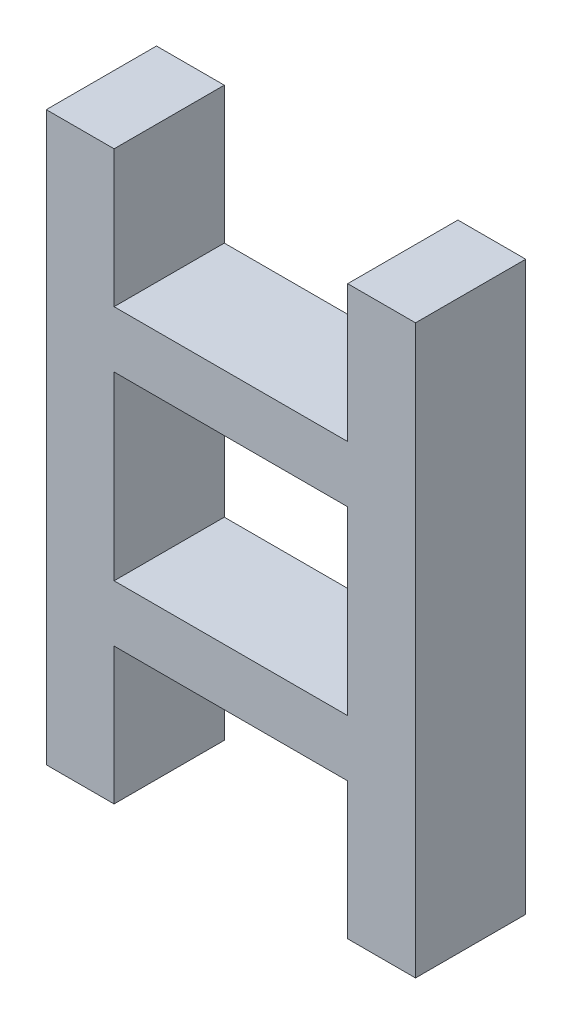
ISO-10303-21;
HEADER;
FILE_DESCRIPTION(('STEP AP214'),'2;1');
FILE_NAME('part.step','',(''),(''),'','','');
FILE_SCHEMA(('AUTOMOTIVE_DESIGN { 1 0 10303 214 1 1 1 1 }'));
ENDSEC;
DATA;
#1=APPLICATION_CONTEXT('core data for automotive mechanical design processes');
#2=APPLICATION_PROTOCOL_DEFINITION('international standard','automotive_design',2000,#1);
#3=PRODUCT_CONTEXT('',#1,'mechanical');
#4=PRODUCT('Part','Part','',(#3));
#5=PRODUCT_RELATED_PRODUCT_CATEGORY('part','',(#4));
#6=PRODUCT_DEFINITION_FORMATION('','',#4);
#7=PRODUCT_DEFINITION_CONTEXT('part definition',#1,'design');
#8=PRODUCT_DEFINITION('design','',#6,#7);
#9=PRODUCT_DEFINITION_SHAPE('','',#8);
#10=(LENGTH_UNIT() NAMED_UNIT(*) SI_UNIT(.MILLI.,.METRE.));
#11=(NAMED_UNIT(*) PLANE_ANGLE_UNIT() SI_UNIT($,.RADIAN.));
#12=(NAMED_UNIT(*) SI_UNIT($,.STERADIAN.) SOLID_ANGLE_UNIT());
#13=UNCERTAINTY_MEASURE_WITH_UNIT(LENGTH_MEASURE(1.E-05),#10,'distance_accuracy_value','');
#14=(GEOMETRIC_REPRESENTATION_CONTEXT(3) GLOBAL_UNCERTAINTY_ASSIGNED_CONTEXT((#13)) GLOBAL_UNIT_ASSIGNED_CONTEXT((#10,
#11,#12)) REPRESENTATION_CONTEXT('',''));
#15=CARTESIAN_POINT('',(0.,0.,0.));
#16=DIRECTION('',(0.,0.,1.));
#17=DIRECTION('',(1.,0.,0.));
#18=AXIS2_PLACEMENT_3D('',#15,#16,#17);
#19=CARTESIAN_POINT('',(1259.60962355286,948.827195660845,5.85));
#20=DIRECTION('',(0.,0.,1.));
#21=DIRECTION('',(1.,0.,0.));
#22=AXIS2_PLACEMENT_3D('',#19,#20,#21);
#23=PLANE('',#22);
#24=DIRECTION('',(1.,0.,0.));
#25=VECTOR('',#24,1.);
#26=CARTESIAN_POINT('',(1247.20962355286,948.827195660845,5.85));
#27=LINE('',#26,#25);
#28=CARTESIAN_POINT('',(1247.20962355286,948.827195660845,5.85));
#29=VERTEX_POINT('',#28);
#30=CARTESIAN_POINT('',(1259.60962355286,948.827195660845,5.85));
#31=VERTEX_POINT('',#30);
#32=EDGE_CURVE('E196',#29,#31,#27,.T.);
#33=ORIENTED_EDGE('',*,*,#32,.T.);
#34=DIRECTION('',(0.,-1.,0.));
#35=VECTOR('',#34,1.);
#36=CARTESIAN_POINT('',(1259.60962355286,941.568029887523,5.85));
#37=LINE('',#36,#35);
#38=CARTESIAN_POINT('',(1259.60962355286,941.568029887523,5.85));
#39=VERTEX_POINT('',#38);
#40=EDGE_CURVE('E201',#31,#39,#37,.T.);
#41=ORIENTED_EDGE('',*,*,#40,.T.);
#42=DIRECTION('',(1.,0.,0.));
#43=VECTOR('',#42,1.);
#44=CARTESIAN_POINT('',(1259.60962355286,941.568029887523,5.85));
#45=LINE('',#44,#43);
#46=CARTESIAN_POINT('',(1263.20962355286,941.568029887523,5.85));
#47=VERTEX_POINT('',#46);
#48=EDGE_CURVE('E211',#39,#47,#45,.T.);
#49=ORIENTED_EDGE('',*,*,#48,.T.);
#50=DIRECTION('',(0.,1.,0.));
#51=VECTOR('',#50,1.);
#52=CARTESIAN_POINT('',(1263.20962355286,971.686361434167,5.85));
#53=LINE('',#52,#51);
#54=CARTESIAN_POINT('',(1263.20962355286,971.686361434167,5.85));
#55=VERTEX_POINT('',#54);
#56=EDGE_CURVE('E214',#47,#55,#53,.T.);
#57=ORIENTED_EDGE('',*,*,#56,.T.);
#58=DIRECTION('',(-1.,0.,0.));
#59=VECTOR('',#58,1.);
#60=CARTESIAN_POINT('',(1259.60962355286,971.686361434167,5.85));
#61=LINE('',#60,#59);
#62=CARTESIAN_POINT('',(1259.60962355286,971.686361434167,5.85));
#63=VERTEX_POINT('',#62);
#64=EDGE_CURVE('E218',#55,#63,#61,.T.);
#65=ORIENTED_EDGE('',*,*,#64,.T.);
#66=DIRECTION('',(0.,-1.,0.));
#67=VECTOR('',#66,1.);
#68=CARTESIAN_POINT('',(1259.60962355286,964.427195660845,5.85));
#69=LINE('',#68,#67);
#70=CARTESIAN_POINT('',(1259.60962355286,964.427195660845,5.85));
#71=VERTEX_POINT('',#70);
#72=EDGE_CURVE('E222',#63,#71,#69,.T.);
#73=ORIENTED_EDGE('',*,*,#72,.T.);
#74=DIRECTION('',(-1.,0.,0.));
#75=VECTOR('',#74,1.);
#76=CARTESIAN_POINT('',(1247.20962355286,964.427195660845,5.85));
#77=LINE('',#76,#75);
#78=CARTESIAN_POINT('',(1247.20962355286,964.427195660845,5.85));
#79=VERTEX_POINT('',#78);
#80=EDGE_CURVE('E230',#71,#79,#77,.T.);
#81=ORIENTED_EDGE('',*,*,#80,.T.);
#82=DIRECTION('',(0.,1.,0.));
#83=VECTOR('',#82,1.);
#84=CARTESIAN_POINT('',(1247.20962355286,971.686361434167,5.85));
#85=LINE('',#84,#83);
#86=CARTESIAN_POINT('',(1247.20962355286,971.686361434167,5.85));
#87=VERTEX_POINT('',#86);
#88=EDGE_CURVE('E233',#79,#87,#85,.T.);
#89=ORIENTED_EDGE('',*,*,#88,.T.);
#90=DIRECTION('',(-1.,0.,0.));
#91=VECTOR('',#90,1.);
#92=CARTESIAN_POINT('',(1243.60962355286,971.686361434167,5.85));
#93=LINE('',#92,#91);
#94=CARTESIAN_POINT('',(1243.60962355286,971.686361434167,5.85));
#95=VERTEX_POINT('',#94);
#96=EDGE_CURVE('E237',#87,#95,#93,.T.);
#97=ORIENTED_EDGE('',*,*,#96,.T.);
#98=DIRECTION('',(0.,-1.,0.));
#99=VECTOR('',#98,1.);
#100=CARTESIAN_POINT('',(1243.60962355286,941.568029887523,5.85));
#101=LINE('',#100,#99);
#102=CARTESIAN_POINT('',(1243.60962355286,941.568029887523,5.85));
#103=VERTEX_POINT('',#102);
#104=EDGE_CURVE('E241',#95,#103,#101,.T.);
#105=ORIENTED_EDGE('',*,*,#104,.T.);
#106=DIRECTION('',(1.,0.,0.));
#107=VECTOR('',#106,1.);
#108=CARTESIAN_POINT('',(1247.20962355286,941.568029887523,5.85));
#109=LINE('',#108,#107);
#110=CARTESIAN_POINT('',(1247.20962355286,941.568029887523,5.85));
#111=VERTEX_POINT('',#110);
#112=EDGE_CURVE('E245',#103,#111,#109,.T.);
#113=ORIENTED_EDGE('',*,*,#112,.T.);
#114=DIRECTION('',(0.,1.,0.));
#115=VECTOR('',#114,1.);
#116=CARTESIAN_POINT('',(1247.20962355286,948.827195660845,5.85));
#117=LINE('',#116,#115);
#118=EDGE_CURVE('E248',#111,#29,#117,.T.);
#119=ORIENTED_EDGE('',*,*,#118,.T.);
#120=EDGE_LOOP('',(#33,#41,#49,#57,#65,#73,#81,#89,#97,#105,#113,#119));
#121=FACE_BOUND('',#120,.T.);
#122=DIRECTION('',(0.,1.,0.));
#123=VECTOR('',#122,1.);
#124=CARTESIAN_POINT('',(1259.60962355286,961.427195660845,5.85));
#125=LINE('',#124,#123);
#126=CARTESIAN_POINT('',(1259.60962355286,951.827195660845,5.85));
#127=VERTEX_POINT('',#126);
#128=CARTESIAN_POINT('',(1259.60962355286,961.427195660845,5.85));
#129=VERTEX_POINT('',#128);
#130=EDGE_CURVE('E156',#127,#129,#125,.T.);
#131=ORIENTED_EDGE('',*,*,#130,.F.);
#132=DIRECTION('',(1.,0.,0.));
#133=VECTOR('',#132,1.);
#134=CARTESIAN_POINT('',(1247.20962355286,951.827195660845,5.85));
#135=LINE('',#134,#133);
#136=CARTESIAN_POINT('',(1247.20962355286,951.827195660845,5.85));
#137=VERTEX_POINT('',#136);
#138=EDGE_CURVE('E147',#137,#127,#135,.T.);
#139=ORIENTED_EDGE('',*,*,#138,.F.);
#140=DIRECTION('',(0.,-1.,0.));
#141=VECTOR('',#140,1.);
#142=CARTESIAN_POINT('',(1247.20962355286,961.427195660845,5.85));
#143=LINE('',#142,#141);
#144=CARTESIAN_POINT('',(1247.20962355286,961.427195660845,5.85));
#145=VERTEX_POINT('',#144);
#146=EDGE_CURVE('E173',#145,#137,#143,.T.);
#147=ORIENTED_EDGE('',*,*,#146,.F.);
#148=DIRECTION('',(-1.,0.,0.));
#149=VECTOR('',#148,1.);
#150=CARTESIAN_POINT('',(1247.20962355286,961.427195660845,5.85));
#151=LINE('',#150,#149);
#152=EDGE_CURVE('E168',#129,#145,#151,.T.);
#153=ORIENTED_EDGE('',*,*,#152,.F.);
#154=EDGE_LOOP('',(#131,#139,#147,#153));
#155=FACE_BOUND('',#154,.T.);
#156=ADVANCED_FACE('F34',(#121,#155),#23,.T.);
#157=CARTESIAN_POINT('',(1259.60962355286,948.827195660845,0.));
#158=DIRECTION('',(0.,0.,1.));
#159=DIRECTION('',(1.,0.,0.));
#160=AXIS2_PLACEMENT_3D('',#157,#158,#159);
#161=PLANE('',#160);
#162=DIRECTION('',(1.,0.,0.));
#163=VECTOR('',#162,1.);
#164=CARTESIAN_POINT('',(1247.20962355286,948.827195660845,0.));
#165=LINE('',#164,#163);
#166=CARTESIAN_POINT('',(1247.20962355286,948.827195660845,0.));
#167=VERTEX_POINT('',#166);
#168=CARTESIAN_POINT('',(1259.60962355286,948.827195660845,0.));
#169=VERTEX_POINT('',#168);
#170=EDGE_CURVE('E164',#167,#169,#165,.T.);
#171=ORIENTED_EDGE('',*,*,#170,.F.);
#172=DIRECTION('',(0.,1.,0.));
#173=VECTOR('',#172,1.);
#174=CARTESIAN_POINT('',(1247.20962355286,948.827195660845,0.));
#175=LINE('',#174,#173);
#176=CARTESIAN_POINT('',(1247.20962355286,941.568029887523,0.));
#177=VERTEX_POINT('',#176);
#178=EDGE_CURVE('E202',#177,#167,#175,.T.);
#179=ORIENTED_EDGE('',*,*,#178,.F.);
#180=DIRECTION('',(1.,0.,0.));
#181=VECTOR('',#180,1.);
#182=CARTESIAN_POINT('',(1247.20962355286,941.568029887523,0.));
#183=LINE('',#182,#181);
#184=CARTESIAN_POINT('',(1243.60962355286,941.568029887523,0.));
#185=VERTEX_POINT('',#184);
#186=EDGE_CURVE('E272',#185,#177,#183,.T.);
#187=ORIENTED_EDGE('',*,*,#186,.F.);
#188=DIRECTION('',(0.,-1.,0.));
#189=VECTOR('',#188,1.);
#190=CARTESIAN_POINT('',(1243.60962355286,941.568029887523,0.));
#191=LINE('',#190,#189);
#192=CARTESIAN_POINT('',(1243.60962355286,971.686361434167,0.));
#193=VERTEX_POINT('',#192);
#194=EDGE_CURVE('E270',#193,#185,#191,.T.);
#195=ORIENTED_EDGE('',*,*,#194,.F.);
#196=DIRECTION('',(-1.,0.,0.));
#197=VECTOR('',#196,1.);
#198=CARTESIAN_POINT('',(1243.60962355286,971.686361434167,0.));
#199=LINE('',#198,#197);
#200=CARTESIAN_POINT('',(1247.20962355286,971.686361434167,0.));
#201=VERTEX_POINT('',#200);
#202=EDGE_CURVE('E268',#201,#193,#199,.T.);
#203=ORIENTED_EDGE('',*,*,#202,.F.);
#204=DIRECTION('',(0.,1.,0.));
#205=VECTOR('',#204,1.);
#206=CARTESIAN_POINT('',(1247.20962355286,971.686361434167,0.));
#207=LINE('',#206,#205);
#208=CARTESIAN_POINT('',(1247.20962355286,964.427195660845,0.));
#209=VERTEX_POINT('',#208);
#210=EDGE_CURVE('E266',#209,#201,#207,.T.);
#211=ORIENTED_EDGE('',*,*,#210,.F.);
#212=DIRECTION('',(-1.,0.,0.));
#213=VECTOR('',#212,1.);
#214=CARTESIAN_POINT('',(1247.20962355286,964.427195660845,0.));
#215=LINE('',#214,#213);
#216=CARTESIAN_POINT('',(1259.60962355286,964.427195660845,0.));
#217=VERTEX_POINT('',#216);
#218=EDGE_CURVE('E264',#217,#209,#215,.T.);
#219=ORIENTED_EDGE('',*,*,#218,.F.);
#220=DIRECTION('',(0.,-1.,0.));
#221=VECTOR('',#220,1.);
#222=CARTESIAN_POINT('',(1259.60962355286,964.427195660845,0.));
#223=LINE('',#222,#221);
#224=CARTESIAN_POINT('',(1259.60962355286,971.686361434167,0.));
#225=VERTEX_POINT('',#224);
#226=EDGE_CURVE('E262',#225,#217,#223,.T.);
#227=ORIENTED_EDGE('',*,*,#226,.F.);
#228=DIRECTION('',(-1.,0.,0.));
#229=VECTOR('',#228,1.);
#230=CARTESIAN_POINT('',(1259.60962355286,971.686361434167,0.));
#231=LINE('',#230,#229);
#232=CARTESIAN_POINT('',(1263.20962355286,971.686361434167,0.));
#233=VERTEX_POINT('',#232);
#234=EDGE_CURVE('E260',#233,#225,#231,.T.);
#235=ORIENTED_EDGE('',*,*,#234,.F.);
#236=DIRECTION('',(0.,1.,0.));
#237=VECTOR('',#236,1.);
#238=CARTESIAN_POINT('',(1263.20962355286,971.686361434167,0.));
#239=LINE('',#238,#237);
#240=CARTESIAN_POINT('',(1263.20962355286,941.568029887523,0.));
#241=VERTEX_POINT('',#240);
#242=EDGE_CURVE('E258',#241,#233,#239,.T.);
#243=ORIENTED_EDGE('',*,*,#242,.F.);
#244=DIRECTION('',(1.,0.,0.));
#245=VECTOR('',#244,1.);
#246=CARTESIAN_POINT('',(1259.60962355286,941.568029887523,0.));
#247=LINE('',#246,#245);
#248=CARTESIAN_POINT('',(1259.60962355286,941.568029887523,0.));
#249=VERTEX_POINT('',#248);
#250=EDGE_CURVE('E256',#249,#241,#247,.T.);
#251=ORIENTED_EDGE('',*,*,#250,.F.);
#252=DIRECTION('',(0.,-1.,0.));
#253=VECTOR('',#252,1.);
#254=CARTESIAN_POINT('',(1259.60962355286,941.568029887523,0.));
#255=LINE('',#254,#253);
#256=EDGE_CURVE('E254',#169,#249,#255,.T.);
#257=ORIENTED_EDGE('',*,*,#256,.F.);
#258=EDGE_LOOP('',(#171,#179,#187,#195,#203,#211,#219,#227,#235,#243,#251,#257));
#259=FACE_BOUND('',#258,.T.);
#260=DIRECTION('',(1.,0.,0.));
#261=VECTOR('',#260,1.);
#262=CARTESIAN_POINT('',(1247.20962355286,951.827195660845,0.));
#263=LINE('',#262,#261);
#264=CARTESIAN_POINT('',(1247.20962355286,951.827195660845,0.));
#265=VERTEX_POINT('',#264);
#266=CARTESIAN_POINT('',(1259.60962355286,951.827195660845,0.));
#267=VERTEX_POINT('',#266);
#268=EDGE_CURVE('E57',#265,#267,#263,.T.);
#269=ORIENTED_EDGE('',*,*,#268,.T.);
#270=DIRECTION('',(0.,1.,0.));
#271=VECTOR('',#270,1.);
#272=CARTESIAN_POINT('',(1259.60962355286,961.427195660845,0.));
#273=LINE('',#272,#271);
#274=CARTESIAN_POINT('',(1259.60962355286,961.427195660845,0.));
#275=VERTEX_POINT('',#274);
#276=EDGE_CURVE('E163',#267,#275,#273,.T.);
#277=ORIENTED_EDGE('',*,*,#276,.T.);
#278=DIRECTION('',(-1.,0.,0.));
#279=VECTOR('',#278,1.);
#280=CARTESIAN_POINT('',(1247.20962355286,961.427195660845,0.));
#281=LINE('',#280,#279);
#282=CARTESIAN_POINT('',(1247.20962355286,961.427195660845,0.));
#283=VERTEX_POINT('',#282);
#284=EDGE_CURVE('E188',#275,#283,#281,.T.);
#285=ORIENTED_EDGE('',*,*,#284,.T.);
#286=DIRECTION('',(0.,-1.,0.));
#287=VECTOR('',#286,1.);
#288=CARTESIAN_POINT('',(1247.20962355286,961.427195660845,0.));
#289=LINE('',#288,#287);
#290=EDGE_CURVE('E157',#283,#265,#289,.T.);
#291=ORIENTED_EDGE('',*,*,#290,.T.);
#292=EDGE_LOOP('',(#269,#277,#285,#291));
#293=FACE_BOUND('',#292,.T.);
#294=ADVANCED_FACE('F314',(#259,#293),#161,.F.);
#295=CARTESIAN_POINT('',(1247.20962355286,948.827195660845,5.85));
#296=DIRECTION('',(0.,1.,0.));
#297=DIRECTION('',(0.,0.,1.));
#298=AXIS2_PLACEMENT_3D('',#295,#296,#297);
#299=PLANE('',#298);
#300=ORIENTED_EDGE('',*,*,#170,.T.);
#301=DIRECTION('',(0.,0.,-1.));
#302=VECTOR('',#301,1.);
#303=CARTESIAN_POINT('',(1259.60962355286,948.827195660845,5.85));
#304=LINE('',#303,#302);
#305=EDGE_CURVE('E12',#31,#169,#304,.T.);
#306=ORIENTED_EDGE('',*,*,#305,.F.);
#307=ORIENTED_EDGE('',*,*,#32,.F.);
#308=DIRECTION('',(0.,0.,-1.));
#309=VECTOR('',#308,1.);
#310=CARTESIAN_POINT('',(1247.20962355286,948.827195660845,5.85));
#311=LINE('',#310,#309);
#312=EDGE_CURVE('E251',#29,#167,#311,.T.);
#313=ORIENTED_EDGE('',*,*,#312,.T.);
#314=EDGE_LOOP('',(#300,#306,#307,#313));
#315=FACE_BOUND('',#314,.T.);
#316=ADVANCED_FACE('F36',(#315),#299,.F.);
#317=CARTESIAN_POINT('',(1259.60962355286,941.568029887523,5.85));
#318=DIRECTION('',(1.,0.,0.));
#319=DIRECTION('',(0.,0.,-1.));
#320=AXIS2_PLACEMENT_3D('',#317,#318,#319);
#321=PLANE('',#320);
#322=ORIENTED_EDGE('',*,*,#256,.T.);
#323=DIRECTION('',(0.,0.,-1.));
#324=VECTOR('',#323,1.);
#325=CARTESIAN_POINT('',(1259.60962355286,941.568029887523,5.85));
#326=LINE('',#325,#324);
#327=EDGE_CURVE('E42',#39,#249,#326,.T.);
#328=ORIENTED_EDGE('',*,*,#327,.F.);
#329=ORIENTED_EDGE('',*,*,#40,.F.);
#330=ORIENTED_EDGE('',*,*,#305,.T.);
#331=EDGE_LOOP('',(#322,#328,#329,#330));
#332=FACE_BOUND('',#331,.T.);
#333=ADVANCED_FACE('F352',(#332),#321,.F.);
#334=CARTESIAN_POINT('',(1259.60962355286,941.568029887523,5.85));
#335=DIRECTION('',(0.,1.,0.));
#336=DIRECTION('',(0.,0.,1.));
#337=AXIS2_PLACEMENT_3D('',#334,#335,#336);
#338=PLANE('',#337);
#339=ORIENTED_EDGE('',*,*,#250,.T.);
#340=DIRECTION('',(0.,0.,-1.));
#341=VECTOR('',#340,1.);
#342=CARTESIAN_POINT('',(1263.20962355286,941.568029887523,5.85));
#343=LINE('',#342,#341);
#344=EDGE_CURVE('E301',#47,#241,#343,.T.);
#345=ORIENTED_EDGE('',*,*,#344,.F.);
#346=ORIENTED_EDGE('',*,*,#48,.F.);
#347=ORIENTED_EDGE('',*,*,#327,.T.);
#348=EDGE_LOOP('',(#339,#345,#346,#347));
#349=FACE_BOUND('',#348,.T.);
#350=ADVANCED_FACE('F308',(#349),#338,.F.);
#351=CARTESIAN_POINT('',(1263.20962355286,971.686361434167,5.85));
#352=DIRECTION('',(-1.,0.,0.));
#353=DIRECTION('',(0.,0.,1.));
#354=AXIS2_PLACEMENT_3D('',#351,#352,#353);
#355=PLANE('',#354);
#356=ORIENTED_EDGE('',*,*,#242,.T.);
#357=DIRECTION('',(0.,0.,-1.));
#358=VECTOR('',#357,1.);
#359=CARTESIAN_POINT('',(1263.20962355286,971.686361434167,5.85));
#360=LINE('',#359,#358);
#361=EDGE_CURVE('E298',#55,#233,#360,.T.);
#362=ORIENTED_EDGE('',*,*,#361,.F.);
#363=ORIENTED_EDGE('',*,*,#56,.F.);
#364=ORIENTED_EDGE('',*,*,#344,.T.);
#365=EDGE_LOOP('',(#356,#362,#363,#364));
#366=FACE_BOUND('',#365,.T.);
#367=ADVANCED_FACE('F320',(#366),#355,.F.);
#368=CARTESIAN_POINT('',(1259.60962355286,971.686361434167,5.85));
#369=DIRECTION('',(0.,-1.,0.));
#370=DIRECTION('',(0.,0.,-1.));
#371=AXIS2_PLACEMENT_3D('',#368,#369,#370);
#372=PLANE('',#371);
#373=ORIENTED_EDGE('',*,*,#234,.T.);
#374=DIRECTION('',(0.,0.,-1.));
#375=VECTOR('',#374,1.);
#376=CARTESIAN_POINT('',(1259.60962355286,971.686361434167,5.85));
#377=LINE('',#376,#375);
#378=EDGE_CURVE('E295',#63,#225,#377,.T.);
#379=ORIENTED_EDGE('',*,*,#378,.F.);
#380=ORIENTED_EDGE('',*,*,#64,.F.);
#381=ORIENTED_EDGE('',*,*,#361,.T.);
#382=EDGE_LOOP('',(#373,#379,#380,#381));
#383=FACE_BOUND('',#382,.T.);
#384=ADVANCED_FACE('F324',(#383),#372,.F.);
#385=CARTESIAN_POINT('',(1259.60962355286,964.427195660845,5.85));
#386=DIRECTION('',(1.,0.,0.));
#387=DIRECTION('',(0.,0.,-1.));
#388=AXIS2_PLACEMENT_3D('',#385,#386,#387);
#389=PLANE('',#388);
#390=ORIENTED_EDGE('',*,*,#226,.T.);
#391=DIRECTION('',(0.,0.,-1.));
#392=VECTOR('',#391,1.);
#393=CARTESIAN_POINT('',(1259.60962355286,964.427195660845,5.85));
#394=LINE('',#393,#392);
#395=EDGE_CURVE('E292',#71,#217,#394,.T.);
#396=ORIENTED_EDGE('',*,*,#395,.F.);
#397=ORIENTED_EDGE('',*,*,#72,.F.);
#398=ORIENTED_EDGE('',*,*,#378,.T.);
#399=EDGE_LOOP('',(#390,#396,#397,#398));
#400=FACE_BOUND('',#399,.T.);
#401=ADVANCED_FACE('F385',(#400),#389,.F.);
#402=CARTESIAN_POINT('',(1247.20962355286,964.427195660845,5.85));
#403=DIRECTION('',(0.,-1.,0.));
#404=DIRECTION('',(0.,0.,-1.));
#405=AXIS2_PLACEMENT_3D('',#402,#403,#404);
#406=PLANE('',#405);
#407=ORIENTED_EDGE('',*,*,#218,.T.);
#408=DIRECTION('',(0.,0.,-1.));
#409=VECTOR('',#408,1.);
#410=CARTESIAN_POINT('',(1247.20962355286,964.427195660845,5.85));
#411=LINE('',#410,#409);
#412=EDGE_CURVE('E289',#79,#209,#411,.T.);
#413=ORIENTED_EDGE('',*,*,#412,.F.);
#414=ORIENTED_EDGE('',*,*,#80,.F.);
#415=ORIENTED_EDGE('',*,*,#395,.T.);
#416=EDGE_LOOP('',(#407,#413,#414,#415));
#417=FACE_BOUND('',#416,.T.);
#418=ADVANCED_FACE('F381',(#417),#406,.F.);
#419=CARTESIAN_POINT('',(1247.20962355286,971.686361434167,5.85));
#420=DIRECTION('',(-1.,0.,0.));
#421=DIRECTION('',(0.,0.,1.));
#422=AXIS2_PLACEMENT_3D('',#419,#420,#421);
#423=PLANE('',#422);
#424=ORIENTED_EDGE('',*,*,#210,.T.);
#425=DIRECTION('',(0.,0.,-1.));
#426=VECTOR('',#425,1.);
#427=CARTESIAN_POINT('',(1247.20962355286,971.686361434167,5.85));
#428=LINE('',#427,#426);
#429=EDGE_CURVE('E286',#87,#201,#428,.T.);
#430=ORIENTED_EDGE('',*,*,#429,.F.);
#431=ORIENTED_EDGE('',*,*,#88,.F.);
#432=ORIENTED_EDGE('',*,*,#412,.T.);
#433=EDGE_LOOP('',(#424,#430,#431,#432));
#434=FACE_BOUND('',#433,.T.);
#435=ADVANCED_FACE('F377',(#434),#423,.F.);
#436=CARTESIAN_POINT('',(1243.60962355286,971.686361434167,5.85));
#437=DIRECTION('',(0.,-1.,0.));
#438=DIRECTION('',(0.,0.,-1.));
#439=AXIS2_PLACEMENT_3D('',#436,#437,#438);
#440=PLANE('',#439);
#441=ORIENTED_EDGE('',*,*,#202,.T.);
#442=DIRECTION('',(0.,0.,-1.));
#443=VECTOR('',#442,1.);
#444=CARTESIAN_POINT('',(1243.60962355286,971.686361434167,5.85));
#445=LINE('',#444,#443);
#446=EDGE_CURVE('E283',#95,#193,#445,.T.);
#447=ORIENTED_EDGE('',*,*,#446,.F.);
#448=ORIENTED_EDGE('',*,*,#96,.F.);
#449=ORIENTED_EDGE('',*,*,#429,.T.);
#450=EDGE_LOOP('',(#441,#447,#448,#449));
#451=FACE_BOUND('',#450,.T.);
#452=ADVANCED_FACE('F374',(#451),#440,.F.);
#453=CARTESIAN_POINT('',(1243.60962355286,941.568029887523,5.85));
#454=DIRECTION('',(1.,0.,0.));
#455=DIRECTION('',(0.,0.,-1.));
#456=AXIS2_PLACEMENT_3D('',#453,#454,#455);
#457=PLANE('',#456);
#458=ORIENTED_EDGE('',*,*,#194,.T.);
#459=DIRECTION('',(0.,0.,-1.));
#460=VECTOR('',#459,1.);
#461=CARTESIAN_POINT('',(1243.60962355286,941.568029887523,5.85));
#462=LINE('',#461,#460);
#463=EDGE_CURVE('E280',#103,#185,#462,.T.);
#464=ORIENTED_EDGE('',*,*,#463,.F.);
#465=ORIENTED_EDGE('',*,*,#104,.F.);
#466=ORIENTED_EDGE('',*,*,#446,.T.);
#467=EDGE_LOOP('',(#458,#464,#465,#466));
#468=FACE_BOUND('',#467,.T.);
#469=ADVANCED_FACE('F341',(#468),#457,.F.);
#470=CARTESIAN_POINT('',(1247.20962355286,941.568029887523,5.85));
#471=DIRECTION('',(0.,1.,0.));
#472=DIRECTION('',(0.,0.,1.));
#473=AXIS2_PLACEMENT_3D('',#470,#471,#472);
#474=PLANE('',#473);
#475=ORIENTED_EDGE('',*,*,#186,.T.);
#476=DIRECTION('',(0.,0.,-1.));
#477=VECTOR('',#476,1.);
#478=CARTESIAN_POINT('',(1247.20962355286,941.568029887523,5.85));
#479=LINE('',#478,#477);
#480=EDGE_CURVE('E277',#111,#177,#479,.T.);
#481=ORIENTED_EDGE('',*,*,#480,.F.);
#482=ORIENTED_EDGE('',*,*,#112,.F.);
#483=ORIENTED_EDGE('',*,*,#463,.T.);
#484=EDGE_LOOP('',(#475,#481,#482,#483));
#485=FACE_BOUND('',#484,.T.);
#486=ADVANCED_FACE('F345',(#485),#474,.F.);
#487=CARTESIAN_POINT('',(1247.20962355286,948.827195660845,5.85));
#488=DIRECTION('',(-1.,0.,0.));
#489=DIRECTION('',(0.,0.,1.));
#490=AXIS2_PLACEMENT_3D('',#487,#488,#489);
#491=PLANE('',#490);
#492=ORIENTED_EDGE('',*,*,#178,.T.);
#493=ORIENTED_EDGE('',*,*,#312,.F.);
#494=ORIENTED_EDGE('',*,*,#118,.F.);
#495=ORIENTED_EDGE('',*,*,#480,.T.);
#496=EDGE_LOOP('',(#492,#493,#494,#495));
#497=FACE_BOUND('',#496,.T.);
#498=ADVANCED_FACE('F350',(#497),#491,.F.);
#499=CARTESIAN_POINT('',(1247.20962355286,951.827195660845,5.85));
#500=DIRECTION('',(0.,1.,0.));
#501=DIRECTION('',(0.,0.,1.));
#502=AXIS2_PLACEMENT_3D('',#499,#500,#501);
#503=PLANE('',#502);
#504=ORIENTED_EDGE('',*,*,#268,.F.);
#505=DIRECTION('',(0.,0.,-1.));
#506=VECTOR('',#505,1.);
#507=CARTESIAN_POINT('',(1247.20962355286,951.827195660845,5.85));
#508=LINE('',#507,#506);
#509=EDGE_CURVE('E151',#137,#265,#508,.T.);
#510=ORIENTED_EDGE('',*,*,#509,.F.);
#511=ORIENTED_EDGE('',*,*,#138,.T.);
#512=DIRECTION('',(0.,0.,-1.));
#513=VECTOR('',#512,1.);
#514=CARTESIAN_POINT('',(1259.60962355286,951.827195660845,5.85));
#515=LINE('',#514,#513);
#516=EDGE_CURVE('E150',#127,#267,#515,.T.);
#517=ORIENTED_EDGE('',*,*,#516,.T.);
#518=EDGE_LOOP('',(#504,#510,#511,#517));
#519=FACE_BOUND('',#518,.T.);
#520=ADVANCED_FACE('F149',(#519),#503,.T.);
#521=CARTESIAN_POINT('',(1259.60962355286,961.427195660845,5.85));
#522=DIRECTION('',(-1.,0.,0.));
#523=DIRECTION('',(0.,0.,1.));
#524=AXIS2_PLACEMENT_3D('',#521,#522,#523);
#525=PLANE('',#524);
#526=ORIENTED_EDGE('',*,*,#276,.F.);
#527=ORIENTED_EDGE('',*,*,#516,.F.);
#528=ORIENTED_EDGE('',*,*,#130,.T.);
#529=DIRECTION('',(0.,0.,-1.));
#530=VECTOR('',#529,1.);
#531=CARTESIAN_POINT('',(1259.60962355286,961.427195660845,5.85));
#532=LINE('',#531,#530);
#533=EDGE_CURVE('E165',#129,#275,#532,.T.);
#534=ORIENTED_EDGE('',*,*,#533,.T.);
#535=EDGE_LOOP('',(#526,#527,#528,#534));
#536=FACE_BOUND('',#535,.T.);
#537=ADVANCED_FACE('F160',(#536),#525,.T.);
#538=CARTESIAN_POINT('',(1247.20962355286,961.427195660845,5.85));
#539=DIRECTION('',(0.,-1.,0.));
#540=DIRECTION('',(0.,0.,-1.));
#541=AXIS2_PLACEMENT_3D('',#538,#539,#540);
#542=PLANE('',#541);
#543=ORIENTED_EDGE('',*,*,#284,.F.);
#544=ORIENTED_EDGE('',*,*,#533,.F.);
#545=ORIENTED_EDGE('',*,*,#152,.T.);
#546=DIRECTION('',(0.,0.,-1.));
#547=VECTOR('',#546,1.);
#548=CARTESIAN_POINT('',(1247.20962355286,961.427195660845,5.85));
#549=LINE('',#548,#547);
#550=EDGE_CURVE('E49',#145,#283,#549,.T.);
#551=ORIENTED_EDGE('',*,*,#550,.T.);
#552=EDGE_LOOP('',(#543,#544,#545,#551));
#553=FACE_BOUND('',#552,.T.);
#554=ADVANCED_FACE('F440',(#553),#542,.T.);
#555=CARTESIAN_POINT('',(1247.20962355286,961.427195660845,5.85));
#556=DIRECTION('',(1.,0.,0.));
#557=DIRECTION('',(0.,0.,-1.));
#558=AXIS2_PLACEMENT_3D('',#555,#556,#557);
#559=PLANE('',#558);
#560=ORIENTED_EDGE('',*,*,#290,.F.);
#561=ORIENTED_EDGE('',*,*,#550,.F.);
#562=ORIENTED_EDGE('',*,*,#146,.T.);
#563=ORIENTED_EDGE('',*,*,#509,.T.);
#564=EDGE_LOOP('',(#560,#561,#562,#563));
#565=FACE_BOUND('',#564,.T.);
#566=ADVANCED_FACE('F446',(#565),#559,.T.);
#567=CLOSED_SHELL('',(#156,#294,#316,#333,#350,#367,#384,#401,#418,#435,#452,#469,#486,#498,
#520,#537,#554,#566));
#568=MANIFOLD_SOLID_BREP('B2',#567);
#569=ADVANCED_BREP_SHAPE_REPRESENTATION('',(#18,#568),#14);
#570=SHAPE_DEFINITION_REPRESENTATION(#9,#569);
ENDSEC;
END-ISO-10303-21;
